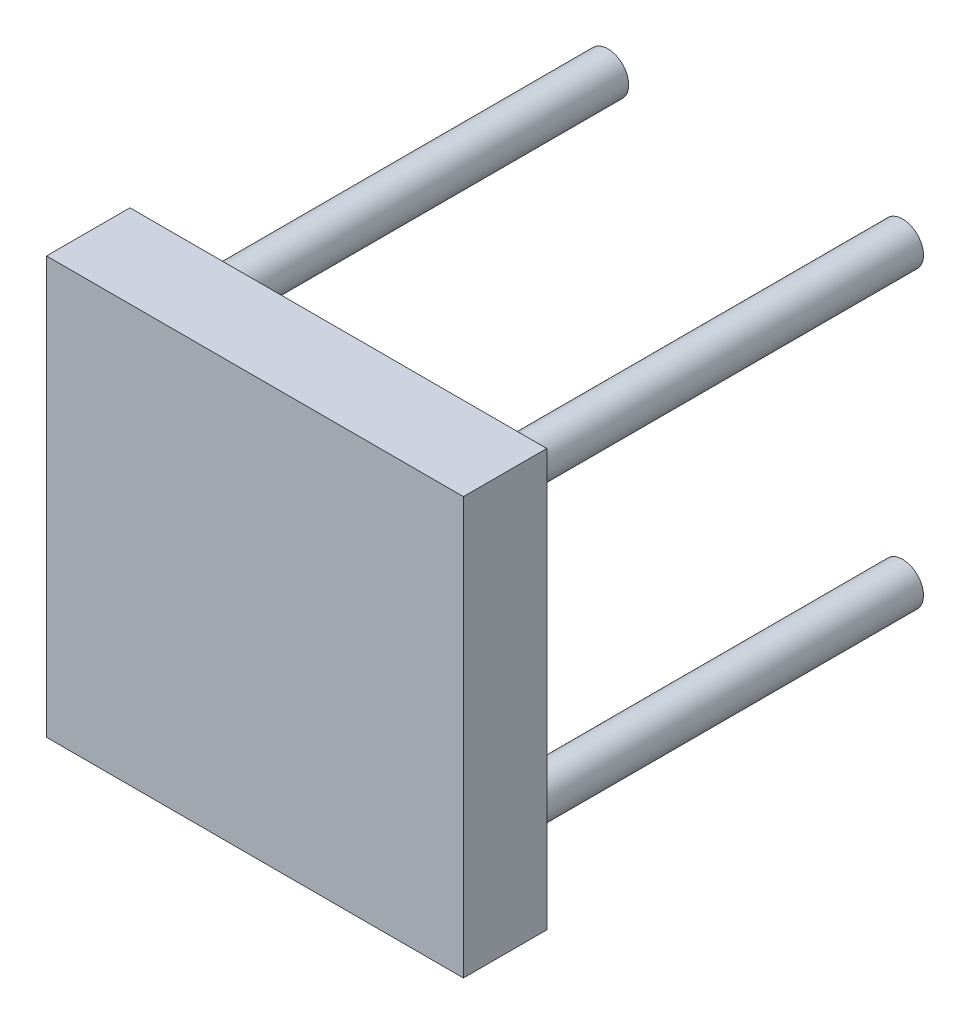
ISO-10303-21;
HEADER;
FILE_DESCRIPTION(('STEP AP214'),'2;1');
FILE_NAME('part.step','',(''),(''),'','','');
FILE_SCHEMA(('AUTOMOTIVE_DESIGN { 1 0 10303 214 1 1 1 1 }'));
ENDSEC;
DATA;
#1=APPLICATION_CONTEXT('core data for automotive mechanical design processes');
#2=APPLICATION_PROTOCOL_DEFINITION('international standard','automotive_design',2000,#1);
#3=PRODUCT_CONTEXT('',#1,'mechanical');
#4=PRODUCT('Part','Part','',(#3));
#5=PRODUCT_RELATED_PRODUCT_CATEGORY('part','',(#4));
#6=PRODUCT_DEFINITION_FORMATION('','',#4);
#7=PRODUCT_DEFINITION_CONTEXT('part definition',#1,'design');
#8=PRODUCT_DEFINITION('design','',#6,#7);
#9=PRODUCT_DEFINITION_SHAPE('','',#8);
#10=(LENGTH_UNIT() NAMED_UNIT(*) SI_UNIT(.MILLI.,.METRE.));
#11=(NAMED_UNIT(*) PLANE_ANGLE_UNIT() SI_UNIT($,.RADIAN.));
#12=(NAMED_UNIT(*) SI_UNIT($,.STERADIAN.) SOLID_ANGLE_UNIT());
#13=UNCERTAINTY_MEASURE_WITH_UNIT(LENGTH_MEASURE(1.E-05),#10,'distance_accuracy_value','');
#14=(GEOMETRIC_REPRESENTATION_CONTEXT(3) GLOBAL_UNCERTAINTY_ASSIGNED_CONTEXT((#13)) GLOBAL_UNIT_ASSIGNED_CONTEXT((#10,
#11,#12)) REPRESENTATION_CONTEXT('',''));
#15=CARTESIAN_POINT('',(0.,0.,0.));
#16=DIRECTION('',(0.,0.,1.));
#17=DIRECTION('',(1.,0.,0.));
#18=AXIS2_PLACEMENT_3D('',#15,#16,#17);
#19=CARTESIAN_POINT('',(0.05,-0.05,-0.02));
#20=DIRECTION('',(1.,0.,0.));
#21=DIRECTION('',(0.,0.,-1.));
#22=AXIS2_PLACEMENT_3D('',#19,#20,#21);
#23=PLANE('',#22);
#24=DIRECTION('',(0.,1.,0.));
#25=VECTOR('',#24,1.);
#26=CARTESIAN_POINT('',(0.05,-0.05,0.));
#27=LINE('',#26,#25);
#28=CARTESIAN_POINT('',(0.05,-0.05,0.));
#29=VERTEX_POINT('',#28);
#30=CARTESIAN_POINT('',(0.05,0.05,0.));
#31=VERTEX_POINT('',#30);
#32=EDGE_CURVE('E106',#29,#31,#27,.T.);
#33=ORIENTED_EDGE('',*,*,#32,.F.);
#34=DIRECTION('',(0.,0.,1.));
#35=VECTOR('',#34,1.);
#36=CARTESIAN_POINT('',(0.05,-0.05,-0.02));
#37=LINE('',#36,#35);
#38=CARTESIAN_POINT('',(0.05,-0.05,-0.02));
#39=VERTEX_POINT('',#38);
#40=EDGE_CURVE('E47',#39,#29,#37,.T.);
#41=ORIENTED_EDGE('',*,*,#40,.F.);
#42=DIRECTION('',(0.,1.,0.));
#43=VECTOR('',#42,1.);
#44=CARTESIAN_POINT('',(0.05,-0.05,-0.02));
#45=LINE('',#44,#43);
#46=CARTESIAN_POINT('',(0.05,0.05,-0.02));
#47=VERTEX_POINT('',#46);
#48=EDGE_CURVE('E99',#39,#47,#45,.T.);
#49=ORIENTED_EDGE('',*,*,#48,.T.);
#50=DIRECTION('',(0.,0.,1.));
#51=VECTOR('',#50,1.);
#52=CARTESIAN_POINT('',(0.05,0.05,-0.02));
#53=LINE('',#52,#51);
#54=EDGE_CURVE('E82',#47,#31,#53,.T.);
#55=ORIENTED_EDGE('',*,*,#54,.T.);
#56=EDGE_LOOP('',(#33,#41,#49,#55));
#57=FACE_BOUND('',#56,.T.);
#58=ADVANCED_FACE('F39',(#57),#23,.T.);
#59=CARTESIAN_POINT('',(-0.05,-0.05,-0.02));
#60=DIRECTION('',(0.,-1.,0.));
#61=DIRECTION('',(0.,0.,-1.));
#62=AXIS2_PLACEMENT_3D('',#59,#60,#61);
#63=PLANE('',#62);
#64=DIRECTION('',(1.,0.,0.));
#65=VECTOR('',#64,1.);
#66=CARTESIAN_POINT('',(-0.05,-0.05,0.));
#67=LINE('',#66,#65);
#68=CARTESIAN_POINT('',(-0.05,-0.05,0.));
#69=VERTEX_POINT('',#68);
#70=EDGE_CURVE('E101',#69,#29,#67,.T.);
#71=ORIENTED_EDGE('',*,*,#70,.F.);
#72=DIRECTION('',(0.,0.,1.));
#73=VECTOR('',#72,1.);
#74=CARTESIAN_POINT('',(-0.05,-0.05,-0.02));
#75=LINE('',#74,#73);
#76=CARTESIAN_POINT('',(-0.05,-0.05,-0.02));
#77=VERTEX_POINT('',#76);
#78=EDGE_CURVE('E71',#77,#69,#75,.T.);
#79=ORIENTED_EDGE('',*,*,#78,.F.);
#80=DIRECTION('',(1.,0.,0.));
#81=VECTOR('',#80,1.);
#82=CARTESIAN_POINT('',(-0.05,-0.05,-0.02));
#83=LINE('',#82,#81);
#84=EDGE_CURVE('E96',#77,#39,#83,.T.);
#85=ORIENTED_EDGE('',*,*,#84,.T.);
#86=ORIENTED_EDGE('',*,*,#40,.T.);
#87=EDGE_LOOP('',(#71,#79,#85,#86));
#88=FACE_BOUND('',#87,.T.);
#89=ADVANCED_FACE('F118',(#88),#63,.T.);
#90=CARTESIAN_POINT('',(-0.05,-0.05,-0.02));
#91=DIRECTION('',(-1.,0.,0.));
#92=DIRECTION('',(0.,0.,1.));
#93=AXIS2_PLACEMENT_3D('',#90,#91,#92);
#94=PLANE('',#93);
#95=DIRECTION('',(0.,-1.,0.));
#96=VECTOR('',#95,1.);
#97=CARTESIAN_POINT('',(-0.05,-0.05,0.));
#98=LINE('',#97,#96);
#99=CARTESIAN_POINT('',(-0.05,0.05,0.));
#100=VERTEX_POINT('',#99);
#101=EDGE_CURVE('E90',#100,#69,#98,.T.);
#102=ORIENTED_EDGE('',*,*,#101,.F.);
#103=DIRECTION('',(0.,0.,1.));
#104=VECTOR('',#103,1.);
#105=CARTESIAN_POINT('',(-0.05,0.05,-0.02));
#106=LINE('',#105,#104);
#107=CARTESIAN_POINT('',(-0.05,0.05,-0.02));
#108=VERTEX_POINT('',#107);
#109=EDGE_CURVE('E85',#108,#100,#106,.T.);
#110=ORIENTED_EDGE('',*,*,#109,.F.);
#111=DIRECTION('',(0.,-1.,0.));
#112=VECTOR('',#111,1.);
#113=CARTESIAN_POINT('',(-0.05,-0.05,-0.02));
#114=LINE('',#113,#112);
#115=EDGE_CURVE('E88',#108,#77,#114,.T.);
#116=ORIENTED_EDGE('',*,*,#115,.T.);
#117=ORIENTED_EDGE('',*,*,#78,.T.);
#118=EDGE_LOOP('',(#102,#110,#116,#117));
#119=FACE_BOUND('',#118,.T.);
#120=ADVANCED_FACE('F87',(#119),#94,.T.);
#121=CARTESIAN_POINT('',(-0.05,0.05,-0.02));
#122=DIRECTION('',(0.,1.,0.));
#123=DIRECTION('',(0.,0.,1.));
#124=AXIS2_PLACEMENT_3D('',#121,#122,#123);
#125=PLANE('',#124);
#126=DIRECTION('',(-1.,0.,0.));
#127=VECTOR('',#126,1.);
#128=CARTESIAN_POINT('',(-0.05,0.05,0.));
#129=LINE('',#128,#127);
#130=EDGE_CURVE('E109',#31,#100,#129,.T.);
#131=ORIENTED_EDGE('',*,*,#130,.F.);
#132=ORIENTED_EDGE('',*,*,#54,.F.);
#133=DIRECTION('',(-1.,0.,0.));
#134=VECTOR('',#133,1.);
#135=CARTESIAN_POINT('',(-0.05,0.05,-0.02));
#136=LINE('',#135,#134);
#137=EDGE_CURVE('E95',#47,#108,#136,.T.);
#138=ORIENTED_EDGE('',*,*,#137,.T.);
#139=ORIENTED_EDGE('',*,*,#109,.T.);
#140=EDGE_LOOP('',(#131,#132,#138,#139));
#141=FACE_BOUND('',#140,.T.);
#142=ADVANCED_FACE('F98',(#141),#125,.T.);
#143=CARTESIAN_POINT('',(0.,0.,-0.02));
#144=DIRECTION('',(0.,0.,-1.));
#145=DIRECTION('',(-1.,0.,0.));
#146=AXIS2_PLACEMENT_3D('',#143,#144,#145);
#147=PLANE('',#146);
#148=CARTESIAN_POINT('',(0.0353553390593274,-0.0353553390593274,-0.02));
#149=DIRECTION('',(0.,0.,-1.));
#150=DIRECTION('',(-1.,0.,0.));
#151=AXIS2_PLACEMENT_3D('',#148,#149,#150);
#152=CIRCLE('',#151,0.00499999999999998);
#153=CARTESIAN_POINT('',(0.0303553390593274,-0.0353553390593274,-0.02));
#154=VERTEX_POINT('',#153);
#155=EDGE_CURVE('E11',#154,#154,#152,.T.);
#156=ORIENTED_EDGE('',*,*,#155,.F.);
#157=EDGE_LOOP('',(#156));
#158=FACE_BOUND('',#157,.T.);
#159=CARTESIAN_POINT('',(-0.0353553390593274,-0.0353553390593274,-0.02));
#160=DIRECTION('',(0.,0.,-1.));
#161=DIRECTION('',(1.,0.,0.));
#162=AXIS2_PLACEMENT_3D('',#159,#160,#161);
#163=CIRCLE('',#162,0.00499999999999998);
#164=CARTESIAN_POINT('',(-0.0303553390593274,-0.0353553390593274,-0.02));
#165=VERTEX_POINT('',#164);
#166=EDGE_CURVE('E175',#165,#165,#163,.T.);
#167=ORIENTED_EDGE('',*,*,#166,.F.);
#168=EDGE_LOOP('',(#167));
#169=FACE_BOUND('',#168,.T.);
#170=CARTESIAN_POINT('',(-0.0353553390593274,0.0353553390593274,-0.02));
#171=DIRECTION('',(0.,0.,1.));
#172=DIRECTION('',(1.,0.,0.));
#173=AXIS2_PLACEMENT_3D('',#170,#171,#172);
#174=CIRCLE('',#173,0.00499999999999998);
#175=CARTESIAN_POINT('',(-0.0303553390593274,0.0353553390593274,-0.02));
#176=VERTEX_POINT('',#175);
#177=EDGE_CURVE('E183',#176,#176,#174,.T.);
#178=ORIENTED_EDGE('',*,*,#177,.T.);
#179=EDGE_LOOP('',(#178));
#180=FACE_BOUND('',#179,.T.);
#181=CARTESIAN_POINT('',(0.0353553390593274,0.0353553390593274,-0.02));
#182=DIRECTION('',(0.,0.,-1.));
#183=DIRECTION('',(-1.,0.,0.));
#184=AXIS2_PLACEMENT_3D('',#181,#182,#183);
#185=CIRCLE('',#184,0.00499999999999998);
#186=CARTESIAN_POINT('',(0.0303553390593274,0.0353553390593274,-0.02));
#187=VERTEX_POINT('',#186);
#188=EDGE_CURVE('E189',#187,#187,#185,.T.);
#189=ORIENTED_EDGE('',*,*,#188,.F.);
#190=EDGE_LOOP('',(#189));
#191=FACE_BOUND('',#190,.T.);
#192=ORIENTED_EDGE('',*,*,#48,.F.);
#193=ORIENTED_EDGE('',*,*,#84,.F.);
#194=ORIENTED_EDGE('',*,*,#115,.F.);
#195=ORIENTED_EDGE('',*,*,#137,.F.);
#196=EDGE_LOOP('',(#192,#193,#194,#195));
#197=FACE_BOUND('',#196,.T.);
#198=ADVANCED_FACE('F94',(#158,#169,#180,#191,#197),#147,.T.);
#199=CARTESIAN_POINT('',(0.,0.,0.));
#200=DIRECTION('',(0.,0.,-1.));
#201=DIRECTION('',(-1.,0.,0.));
#202=AXIS2_PLACEMENT_3D('',#199,#200,#201);
#203=PLANE('',#202);
#204=ORIENTED_EDGE('',*,*,#32,.T.);
#205=ORIENTED_EDGE('',*,*,#130,.T.);
#206=ORIENTED_EDGE('',*,*,#101,.T.);
#207=ORIENTED_EDGE('',*,*,#70,.T.);
#208=EDGE_LOOP('',(#204,#205,#206,#207));
#209=FACE_BOUND('',#208,.T.);
#210=ADVANCED_FACE('F117',(#209),#203,.F.);
#211=CARTESIAN_POINT('',(0.0353553390593274,0.0353553390593274,-0.12));
#212=DIRECTION('',(0.,0.,1.));
#213=DIRECTION('',(1.,0.,0.));
#214=AXIS2_PLACEMENT_3D('',#211,#212,#213);
#215=CYLINDRICAL_SURFACE('',#214,0.00499999999999998);
#216=CARTESIAN_POINT('',(0.0353553390593274,0.0353553390593274,-0.12));
#217=DIRECTION('',(0.,0.,-1.));
#218=DIRECTION('',(-1.,0.,0.));
#219=AXIS2_PLACEMENT_3D('',#216,#217,#218);
#220=CIRCLE('',#219,0.00499999999999998);
#221=CARTESIAN_POINT('',(0.0303553390593274,0.0353553390593274,-0.12));
#222=VERTEX_POINT('',#221);
#223=EDGE_CURVE('E110',#222,#222,#220,.T.);
#224=ORIENTED_EDGE('',*,*,#223,.F.);
#225=EDGE_LOOP('',(#224));
#226=FACE_BOUND('',#225,.T.);
#227=ORIENTED_EDGE('',*,*,#188,.T.);
#228=EDGE_LOOP('',(#227));
#229=FACE_BOUND('',#228,.T.);
#230=ADVANCED_FACE('F136',(#226,#229),#215,.T.);
#231=CARTESIAN_POINT('',(0.0353553390593274,0.0353553390593274,-0.12));
#232=DIRECTION('',(0.,0.,-1.));
#233=DIRECTION('',(-1.,0.,0.));
#234=AXIS2_PLACEMENT_3D('',#231,#232,#233);
#235=PLANE('',#234);
#236=ORIENTED_EDGE('',*,*,#223,.T.);
#237=EDGE_LOOP('',(#236));
#238=FACE_BOUND('',#237,.T.);
#239=ADVANCED_FACE('F142',(#238),#235,.T.);
#240=CARTESIAN_POINT('',(-0.0353553390593274,0.0353553390593274,-0.12));
#241=DIRECTION('',(0.,0.,1.));
#242=DIRECTION('',(-1.,0.,0.));
#243=AXIS2_PLACEMENT_3D('',#240,#241,#242);
#244=CYLINDRICAL_SURFACE('',#243,0.00499999999999998);
#245=CARTESIAN_POINT('',(-0.0353553390593274,0.0353553390593274,-0.12));
#246=DIRECTION('',(0.,0.,1.));
#247=DIRECTION('',(1.,0.,0.));
#248=AXIS2_PLACEMENT_3D('',#245,#246,#247);
#249=CIRCLE('',#248,0.00499999999999998);
#250=CARTESIAN_POINT('',(-0.0303553390593274,0.0353553390593274,-0.12));
#251=VERTEX_POINT('',#250);
#252=EDGE_CURVE('E186',#251,#251,#249,.T.);
#253=ORIENTED_EDGE('',*,*,#252,.T.);
#254=EDGE_LOOP('',(#253));
#255=FACE_BOUND('',#254,.T.);
#256=ORIENTED_EDGE('',*,*,#177,.F.);
#257=EDGE_LOOP('',(#256));
#258=FACE_BOUND('',#257,.T.);
#259=ADVANCED_FACE('F146',(#255,#258),#244,.T.);
#260=CARTESIAN_POINT('',(-0.0353553390593274,0.0353553390593274,-0.12));
#261=DIRECTION('',(0.,0.,-1.));
#262=DIRECTION('',(1.,0.,0.));
#263=AXIS2_PLACEMENT_3D('',#260,#261,#262);
#264=PLANE('',#263);
#265=ORIENTED_EDGE('',*,*,#252,.F.);
#266=EDGE_LOOP('',(#265));
#267=FACE_BOUND('',#266,.T.);
#268=ADVANCED_FACE('F150',(#267),#264,.T.);
#269=CARTESIAN_POINT('',(-0.0353553390593274,-0.0353553390593274,-0.12));
#270=DIRECTION('',(0.,0.,1.));
#271=DIRECTION('',(-1.,0.,0.));
#272=AXIS2_PLACEMENT_3D('',#269,#270,#271);
#273=CYLINDRICAL_SURFACE('',#272,0.00499999999999998);
#274=CARTESIAN_POINT('',(-0.0353553390593274,-0.0353553390593274,-0.12));
#275=DIRECTION('',(0.,0.,-1.));
#276=DIRECTION('',(1.,0.,0.));
#277=AXIS2_PLACEMENT_3D('',#274,#275,#276);
#278=CIRCLE('',#277,0.00499999999999998);
#279=CARTESIAN_POINT('',(-0.0303553390593274,-0.0353553390593274,-0.12));
#280=VERTEX_POINT('',#279);
#281=EDGE_CURVE('E178',#280,#280,#278,.T.);
#282=ORIENTED_EDGE('',*,*,#281,.F.);
#283=EDGE_LOOP('',(#282));
#284=FACE_BOUND('',#283,.T.);
#285=ORIENTED_EDGE('',*,*,#166,.T.);
#286=EDGE_LOOP('',(#285));
#287=FACE_BOUND('',#286,.T.);
#288=ADVANCED_FACE('F154',(#284,#287),#273,.T.);
#289=CARTESIAN_POINT('',(-0.0353553390593274,-0.0353553390593274,-0.12));
#290=DIRECTION('',(0.,0.,-1.));
#291=DIRECTION('',(1.,0.,0.));
#292=AXIS2_PLACEMENT_3D('',#289,#290,#291);
#293=PLANE('',#292);
#294=ORIENTED_EDGE('',*,*,#281,.T.);
#295=EDGE_LOOP('',(#294));
#296=FACE_BOUND('',#295,.T.);
#297=ADVANCED_FACE('F158',(#296),#293,.T.);
#298=CARTESIAN_POINT('',(0.0353553390593274,-0.0353553390593274,-0.12));
#299=DIRECTION('',(0.,0.,1.));
#300=DIRECTION('',(1.,0.,0.));
#301=AXIS2_PLACEMENT_3D('',#298,#299,#300);
#302=CYLINDRICAL_SURFACE('',#301,0.00499999999999998);
#303=CARTESIAN_POINT('',(0.0353553390593274,-0.0353553390593274,-0.12));
#304=DIRECTION('',(0.,0.,1.));
#305=DIRECTION('',(-1.,0.,0.));
#306=AXIS2_PLACEMENT_3D('',#303,#304,#305);
#307=CIRCLE('',#306,0.00499999999999998);
#308=CARTESIAN_POINT('',(0.0303553390593274,-0.0353553390593274,-0.12));
#309=VERTEX_POINT('',#308);
#310=EDGE_CURVE('E174',#309,#309,#307,.T.);
#311=ORIENTED_EDGE('',*,*,#310,.T.);
#312=EDGE_LOOP('',(#311));
#313=FACE_BOUND('',#312,.T.);
#314=ORIENTED_EDGE('',*,*,#155,.T.);
#315=EDGE_LOOP('',(#314));
#316=FACE_BOUND('',#315,.T.);
#317=ADVANCED_FACE('F162',(#313,#316),#302,.T.);
#318=CARTESIAN_POINT('',(0.0353553390593274,-0.0353553390593274,-0.12));
#319=DIRECTION('',(0.,0.,-1.));
#320=DIRECTION('',(-1.,0.,0.));
#321=AXIS2_PLACEMENT_3D('',#318,#319,#320);
#322=PLANE('',#321);
#323=ORIENTED_EDGE('',*,*,#310,.F.);
#324=EDGE_LOOP('',(#323));
#325=FACE_BOUND('',#324,.T.);
#326=ADVANCED_FACE('F166',(#325),#322,.T.);
#327=CLOSED_SHELL('',(#58,#89,#120,#142,#198,#210,#230,#239,#259,#268,#288,#297,#317,#326));
#328=MANIFOLD_SOLID_BREP('B2',#327);
#329=ADVANCED_BREP_SHAPE_REPRESENTATION('',(#18,#328),#14);
#330=SHAPE_DEFINITION_REPRESENTATION(#9,#329);
ENDSEC;
END-ISO-10303-21;
